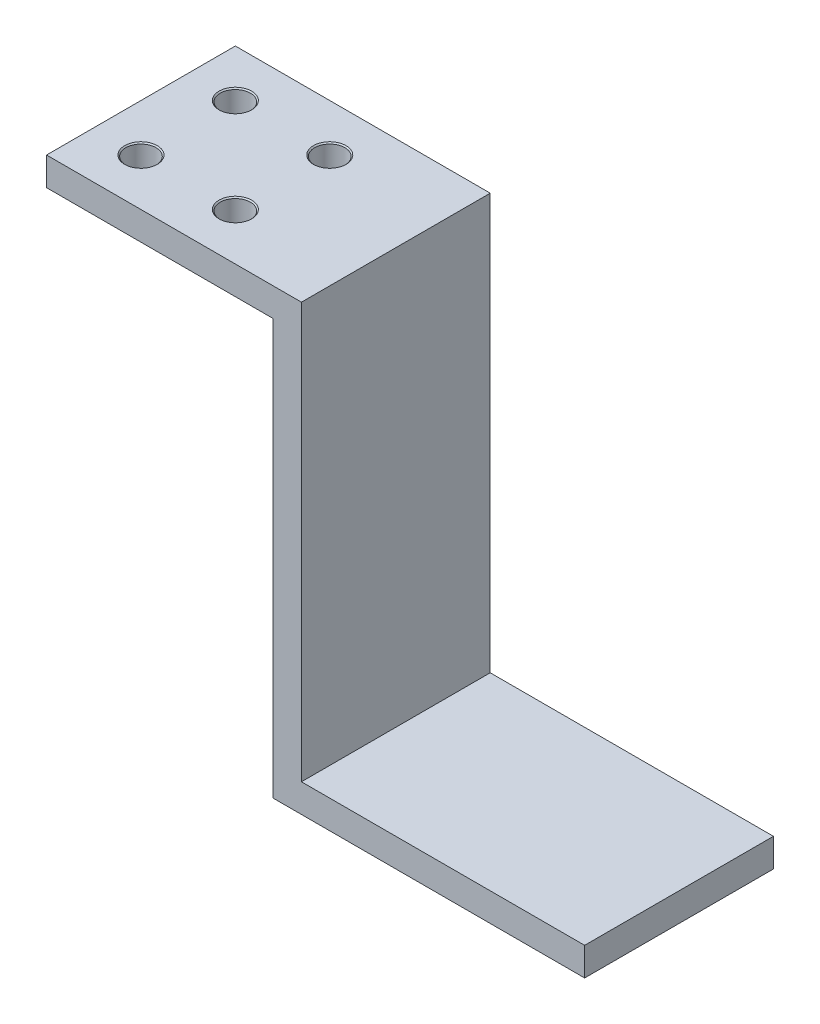
ISO-10303-21;
HEADER;
FILE_DESCRIPTION(('STEP AP214'),'2;1');
FILE_NAME('part.step','',(''),(''),'','','');
FILE_SCHEMA(('AUTOMOTIVE_DESIGN { 1 0 10303 214 1 1 1 1 }'));
ENDSEC;
DATA;
#1=APPLICATION_CONTEXT('core data for automotive mechanical design processes');
#2=APPLICATION_PROTOCOL_DEFINITION('international standard','automotive_design',2000,#1);
#3=PRODUCT_CONTEXT('',#1,'mechanical');
#4=PRODUCT('Part','Part','',(#3));
#5=PRODUCT_RELATED_PRODUCT_CATEGORY('part','',(#4));
#6=PRODUCT_DEFINITION_FORMATION('','',#4);
#7=PRODUCT_DEFINITION_CONTEXT('part definition',#1,'design');
#8=PRODUCT_DEFINITION('design','',#6,#7);
#9=PRODUCT_DEFINITION_SHAPE('','',#8);
#10=(LENGTH_UNIT() NAMED_UNIT(*) SI_UNIT(.MILLI.,.METRE.));
#11=(NAMED_UNIT(*) PLANE_ANGLE_UNIT() SI_UNIT($,.RADIAN.));
#12=(NAMED_UNIT(*) SI_UNIT($,.STERADIAN.) SOLID_ANGLE_UNIT());
#13=UNCERTAINTY_MEASURE_WITH_UNIT(LENGTH_MEASURE(1.E-05),#10,'distance_accuracy_value','');
#14=(GEOMETRIC_REPRESENTATION_CONTEXT(3) GLOBAL_UNCERTAINTY_ASSIGNED_CONTEXT((#13)) GLOBAL_UNIT_ASSIGNED_CONTEXT((#10,
#11,#12)) REPRESENTATION_CONTEXT('',''));
#15=CARTESIAN_POINT('',(0.,0.,0.));
#16=DIRECTION('',(0.,0.,1.));
#17=DIRECTION('',(1.,0.,0.));
#18=AXIS2_PLACEMENT_3D('',#15,#16,#17);
#19=CARTESIAN_POINT('',(0.,47.,20.));
#20=DIRECTION('',(1.,0.,0.));
#21=DIRECTION('',(0.,0.,-1.));
#22=AXIS2_PLACEMENT_3D('',#19,#20,#21);
#23=PLANE('',#22);
#24=DIRECTION('',(0.,-1.,0.));
#25=VECTOR('',#24,1.);
#26=CARTESIAN_POINT('',(0.,47.,0.));
#27=LINE('',#26,#25);
#28=CARTESIAN_POINT('',(0.,47.,0.));
#29=VERTEX_POINT('',#28);
#30=CARTESIAN_POINT('',(0.,44.,0.));
#31=VERTEX_POINT('',#30);
#32=EDGE_CURVE('E142',#29,#31,#27,.T.);
#33=ORIENTED_EDGE('',*,*,#32,.T.);
#34=DIRECTION('',(0.,0.,-1.));
#35=VECTOR('',#34,1.);
#36=CARTESIAN_POINT('',(0.,44.,20.));
#37=LINE('',#36,#35);
#38=CARTESIAN_POINT('',(0.,44.,20.));
#39=VERTEX_POINT('',#38);
#40=EDGE_CURVE('E11',#39,#31,#37,.T.);
#41=ORIENTED_EDGE('',*,*,#40,.F.);
#42=DIRECTION('',(0.,-1.,0.));
#43=VECTOR('',#42,1.);
#44=CARTESIAN_POINT('',(0.,47.,20.));
#45=LINE('',#44,#43);
#46=CARTESIAN_POINT('',(0.,47.,20.));
#47=VERTEX_POINT('',#46);
#48=EDGE_CURVE('E165',#47,#39,#45,.T.);
#49=ORIENTED_EDGE('',*,*,#48,.F.);
#50=DIRECTION('',(0.,0.,-1.));
#51=VECTOR('',#50,1.);
#52=CARTESIAN_POINT('',(0.,47.,20.));
#53=LINE('',#52,#51);
#54=EDGE_CURVE('E138',#47,#29,#53,.T.);
#55=ORIENTED_EDGE('',*,*,#54,.T.);
#56=EDGE_LOOP('',(#33,#41,#49,#55));
#57=FACE_BOUND('',#56,.T.);
#58=ADVANCED_FACE('F39',(#57),#23,.F.);
#59=CARTESIAN_POINT('',(0.,44.,20.));
#60=DIRECTION('',(0.,1.,0.));
#61=DIRECTION('',(0.,0.,1.));
#62=AXIS2_PLACEMENT_3D('',#59,#60,#61);
#63=PLANE('',#62);
#64=CARTESIAN_POINT('',(4.99999999999999,44.,5.));
#65=DIRECTION('',(0.,1.,0.));
#66=DIRECTION('',(0.,0.,1.));
#67=AXIS2_PLACEMENT_3D('',#64,#65,#66);
#68=CIRCLE('',#67,1.59999999999999);
#69=CARTESIAN_POINT('',(4.99999999999999,44.,6.59999999999999));
#70=VERTEX_POINT('',#69);
#71=EDGE_CURVE('E42',#70,#70,#68,.T.);
#72=ORIENTED_EDGE('',*,*,#71,.T.);
#73=EDGE_LOOP('',(#72));
#74=FACE_BOUND('',#73,.T.);
#75=CARTESIAN_POINT('',(4.99999999999999,44.,15.));
#76=DIRECTION('',(0.,1.,0.));
#77=DIRECTION('',(0.,0.,1.));
#78=AXIS2_PLACEMENT_3D('',#75,#76,#77);
#79=CIRCLE('',#78,1.59999999999999);
#80=CARTESIAN_POINT('',(4.99999999999999,44.,16.6));
#81=VERTEX_POINT('',#80);
#82=EDGE_CURVE('E192',#81,#81,#79,.T.);
#83=ORIENTED_EDGE('',*,*,#82,.T.);
#84=EDGE_LOOP('',(#83));
#85=FACE_BOUND('',#84,.T.);
#86=CARTESIAN_POINT('',(15.,44.,5.));
#87=DIRECTION('',(0.,1.,0.));
#88=DIRECTION('',(0.,0.,1.));
#89=AXIS2_PLACEMENT_3D('',#86,#87,#88);
#90=CIRCLE('',#89,1.59999999999999);
#91=CARTESIAN_POINT('',(15.,44.,6.59999999999999));
#92=VERTEX_POINT('',#91);
#93=EDGE_CURVE('E187',#92,#92,#90,.T.);
#94=ORIENTED_EDGE('',*,*,#93,.T.);
#95=EDGE_LOOP('',(#94));
#96=FACE_BOUND('',#95,.T.);
#97=CARTESIAN_POINT('',(15.,44.,15.));
#98=DIRECTION('',(0.,1.,0.));
#99=DIRECTION('',(0.,0.,1.));
#100=AXIS2_PLACEMENT_3D('',#97,#98,#99);
#101=CIRCLE('',#100,1.59999999999999);
#102=CARTESIAN_POINT('',(15.,44.,16.6));
#103=VERTEX_POINT('',#102);
#104=EDGE_CURVE('E147',#103,#103,#101,.T.);
#105=ORIENTED_EDGE('',*,*,#104,.T.);
#106=EDGE_LOOP('',(#105));
#107=FACE_BOUND('',#106,.T.);
#108=DIRECTION('',(1.,0.,0.));
#109=VECTOR('',#108,1.);
#110=CARTESIAN_POINT('',(0.,44.,0.));
#111=LINE('',#110,#109);
#112=CARTESIAN_POINT('',(24.,44.,0.));
#113=VERTEX_POINT('',#112);
#114=EDGE_CURVE('E146',#31,#113,#111,.T.);
#115=ORIENTED_EDGE('',*,*,#114,.T.);
#116=DIRECTION('',(0.,0.,-1.));
#117=VECTOR('',#116,1.);
#118=CARTESIAN_POINT('',(24.,44.,20.));
#119=LINE('',#118,#117);
#120=CARTESIAN_POINT('',(24.,44.,20.));
#121=VERTEX_POINT('',#120);
#122=EDGE_CURVE('E49',#121,#113,#119,.T.);
#123=ORIENTED_EDGE('',*,*,#122,.F.);
#124=DIRECTION('',(1.,0.,0.));
#125=VECTOR('',#124,1.);
#126=CARTESIAN_POINT('',(0.,44.,20.));
#127=LINE('',#126,#125);
#128=EDGE_CURVE('E101',#39,#121,#127,.T.);
#129=ORIENTED_EDGE('',*,*,#128,.F.);
#130=ORIENTED_EDGE('',*,*,#40,.T.);
#131=EDGE_LOOP('',(#115,#123,#129,#130));
#132=FACE_BOUND('',#131,.T.);
#133=ADVANCED_FACE('F263',(#74,#85,#96,#107,#132),#63,.F.);
#134=CARTESIAN_POINT('',(24.,44.,20.));
#135=DIRECTION('',(1.,0.,0.));
#136=DIRECTION('',(0.,1.,0.));
#137=AXIS2_PLACEMENT_3D('',#134,#135,#136);
#138=PLANE('',#137);
#139=DIRECTION('',(0.,-1.,0.));
#140=VECTOR('',#139,1.);
#141=CARTESIAN_POINT('',(24.,44.,0.));
#142=LINE('',#141,#140);
#143=CARTESIAN_POINT('',(24.,0.,0.));
#144=VERTEX_POINT('',#143);
#145=EDGE_CURVE('E150',#113,#144,#142,.T.);
#146=ORIENTED_EDGE('',*,*,#145,.T.);
#147=DIRECTION('',(0.,0.,-1.));
#148=VECTOR('',#147,1.);
#149=CARTESIAN_POINT('',(24.,0.,20.));
#150=LINE('',#149,#148);
#151=CARTESIAN_POINT('',(24.,0.,20.));
#152=VERTEX_POINT('',#151);
#153=EDGE_CURVE('E176',#152,#144,#150,.T.);
#154=ORIENTED_EDGE('',*,*,#153,.F.);
#155=DIRECTION('',(0.,-1.,0.));
#156=VECTOR('',#155,1.);
#157=CARTESIAN_POINT('',(24.,44.,20.));
#158=LINE('',#157,#156);
#159=EDGE_CURVE('E226',#121,#152,#158,.T.);
#160=ORIENTED_EDGE('',*,*,#159,.F.);
#161=ORIENTED_EDGE('',*,*,#122,.T.);
#162=EDGE_LOOP('',(#146,#154,#160,#161));
#163=FACE_BOUND('',#162,.T.);
#164=ADVANCED_FACE('F267',(#163),#138,.F.);
#165=CARTESIAN_POINT('',(24.,0.,20.));
#166=DIRECTION('',(0.,1.,0.));
#167=DIRECTION('',(0.,0.,1.));
#168=AXIS2_PLACEMENT_3D('',#165,#166,#167);
#169=PLANE('',#168);
#170=DIRECTION('',(1.,0.,0.));
#171=VECTOR('',#170,1.);
#172=CARTESIAN_POINT('',(24.,0.,0.));
#173=LINE('',#172,#171);
#174=CARTESIAN_POINT('',(57.,0.,0.));
#175=VERTEX_POINT('',#174);
#176=EDGE_CURVE('E153',#144,#175,#173,.T.);
#177=ORIENTED_EDGE('',*,*,#176,.T.);
#178=DIRECTION('',(0.,0.,-1.));
#179=VECTOR('',#178,1.);
#180=CARTESIAN_POINT('',(57.,0.,20.));
#181=LINE('',#180,#179);
#182=CARTESIAN_POINT('',(57.,0.,20.));
#183=VERTEX_POINT('',#182);
#184=EDGE_CURVE('E172',#183,#175,#181,.T.);
#185=ORIENTED_EDGE('',*,*,#184,.F.);
#186=DIRECTION('',(1.,0.,0.));
#187=VECTOR('',#186,1.);
#188=CARTESIAN_POINT('',(24.,0.,20.));
#189=LINE('',#188,#187);
#190=EDGE_CURVE('E229',#152,#183,#189,.T.);
#191=ORIENTED_EDGE('',*,*,#190,.F.);
#192=ORIENTED_EDGE('',*,*,#153,.T.);
#193=EDGE_LOOP('',(#177,#185,#191,#192));
#194=FACE_BOUND('',#193,.T.);
#195=ADVANCED_FACE('F237',(#194),#169,.F.);
#196=CARTESIAN_POINT('',(57.,0.,20.));
#197=DIRECTION('',(-1.,0.,0.));
#198=DIRECTION('',(0.,-1.,0.));
#199=AXIS2_PLACEMENT_3D('',#196,#197,#198);
#200=PLANE('',#199);
#201=DIRECTION('',(0.,1.,0.));
#202=VECTOR('',#201,1.);
#203=CARTESIAN_POINT('',(57.,0.,0.));
#204=LINE('',#203,#202);
#205=CARTESIAN_POINT('',(57.,3.,0.));
#206=VERTEX_POINT('',#205);
#207=EDGE_CURVE('E156',#175,#206,#204,.T.);
#208=ORIENTED_EDGE('',*,*,#207,.T.);
#209=DIRECTION('',(0.,0.,-1.));
#210=VECTOR('',#209,1.);
#211=CARTESIAN_POINT('',(57.,3.,20.));
#212=LINE('',#211,#210);
#213=CARTESIAN_POINT('',(57.,3.,20.));
#214=VERTEX_POINT('',#213);
#215=EDGE_CURVE('E131',#214,#206,#212,.T.);
#216=ORIENTED_EDGE('',*,*,#215,.F.);
#217=DIRECTION('',(0.,1.,0.));
#218=VECTOR('',#217,1.);
#219=CARTESIAN_POINT('',(57.,0.,20.));
#220=LINE('',#219,#218);
#221=EDGE_CURVE('E120',#183,#214,#220,.T.);
#222=ORIENTED_EDGE('',*,*,#221,.F.);
#223=ORIENTED_EDGE('',*,*,#184,.T.);
#224=EDGE_LOOP('',(#208,#216,#222,#223));
#225=FACE_BOUND('',#224,.T.);
#226=ADVANCED_FACE('F241',(#225),#200,.F.);
#227=CARTESIAN_POINT('',(57.,3.,20.));
#228=DIRECTION('',(0.,-1.,0.));
#229=DIRECTION('',(1.,0.,0.));
#230=AXIS2_PLACEMENT_3D('',#227,#228,#229);
#231=PLANE('',#230);
#232=DIRECTION('',(-1.,0.,0.));
#233=VECTOR('',#232,1.);
#234=CARTESIAN_POINT('',(57.,3.,0.));
#235=LINE('',#234,#233);
#236=CARTESIAN_POINT('',(27.,3.,0.));
#237=VERTEX_POINT('',#236);
#238=EDGE_CURVE('E129',#206,#237,#235,.T.);
#239=ORIENTED_EDGE('',*,*,#238,.T.);
#240=DIRECTION('',(0.,0.,-1.));
#241=VECTOR('',#240,1.);
#242=CARTESIAN_POINT('',(27.,3.,20.));
#243=LINE('',#242,#241);
#244=CARTESIAN_POINT('',(27.,3.,20.));
#245=VERTEX_POINT('',#244);
#246=EDGE_CURVE('E126',#245,#237,#243,.T.);
#247=ORIENTED_EDGE('',*,*,#246,.F.);
#248=DIRECTION('',(-1.,0.,0.));
#249=VECTOR('',#248,1.);
#250=CARTESIAN_POINT('',(57.,3.,20.));
#251=LINE('',#250,#249);
#252=EDGE_CURVE('E114',#214,#245,#251,.T.);
#253=ORIENTED_EDGE('',*,*,#252,.F.);
#254=ORIENTED_EDGE('',*,*,#215,.T.);
#255=EDGE_LOOP('',(#239,#247,#253,#254));
#256=FACE_BOUND('',#255,.T.);
#257=ADVANCED_FACE('F127',(#256),#231,.F.);
#258=CARTESIAN_POINT('',(27.,3.,20.));
#259=DIRECTION('',(-1.,0.,0.));
#260=DIRECTION('',(0.,-1.,0.));
#261=AXIS2_PLACEMENT_3D('',#258,#259,#260);
#262=PLANE('',#261);
#263=DIRECTION('',(0.,1.,0.));
#264=VECTOR('',#263,1.);
#265=CARTESIAN_POINT('',(27.,3.,0.));
#266=LINE('',#265,#264);
#267=CARTESIAN_POINT('',(27.,47.,0.));
#268=VERTEX_POINT('',#267);
#269=EDGE_CURVE('E87',#237,#268,#266,.T.);
#270=ORIENTED_EDGE('',*,*,#269,.T.);
#271=DIRECTION('',(0.,0.,-1.));
#272=VECTOR('',#271,1.);
#273=CARTESIAN_POINT('',(27.,47.,20.));
#274=LINE('',#273,#272);
#275=CARTESIAN_POINT('',(27.,47.,20.));
#276=VERTEX_POINT('',#275);
#277=EDGE_CURVE('E132',#276,#268,#274,.T.);
#278=ORIENTED_EDGE('',*,*,#277,.F.);
#279=DIRECTION('',(0.,1.,0.));
#280=VECTOR('',#279,1.);
#281=CARTESIAN_POINT('',(27.,3.,20.));
#282=LINE('',#281,#280);
#283=EDGE_CURVE('E118',#245,#276,#282,.T.);
#284=ORIENTED_EDGE('',*,*,#283,.F.);
#285=ORIENTED_EDGE('',*,*,#246,.T.);
#286=EDGE_LOOP('',(#270,#278,#284,#285));
#287=FACE_BOUND('',#286,.T.);
#288=ADVANCED_FACE('F134',(#287),#262,.F.);
#289=CARTESIAN_POINT('',(27.,47.,20.));
#290=DIRECTION('',(0.,-1.,0.));
#291=DIRECTION('',(1.,0.,0.));
#292=AXIS2_PLACEMENT_3D('',#289,#290,#291);
#293=PLANE('',#292);
#294=CARTESIAN_POINT('',(4.99999999999999,47.,5.));
#295=DIRECTION('',(0.,1.,0.));
#296=DIRECTION('',(0.,0.,1.));
#297=AXIS2_PLACEMENT_3D('',#294,#295,#296);
#298=CIRCLE('',#297,1.725);
#299=CARTESIAN_POINT('',(4.99999999999999,47.,6.725));
#300=VERTEX_POINT('',#299);
#301=EDGE_CURVE('E400',#300,#300,#298,.T.);
#302=ORIENTED_EDGE('',*,*,#301,.F.);
#303=EDGE_LOOP('',(#302));
#304=FACE_BOUND('',#303,.T.);
#305=CARTESIAN_POINT('',(4.99999999999999,47.,15.));
#306=DIRECTION('',(0.,1.,0.));
#307=DIRECTION('',(0.,0.,1.));
#308=AXIS2_PLACEMENT_3D('',#305,#306,#307);
#309=CIRCLE('',#308,1.725);
#310=CARTESIAN_POINT('',(4.99999999999999,47.,16.725));
#311=VERTEX_POINT('',#310);
#312=EDGE_CURVE('E204',#311,#311,#309,.T.);
#313=ORIENTED_EDGE('',*,*,#312,.F.);
#314=EDGE_LOOP('',(#313));
#315=FACE_BOUND('',#314,.T.);
#316=CARTESIAN_POINT('',(15.,47.,5.));
#317=DIRECTION('',(0.,1.,0.));
#318=DIRECTION('',(0.,0.,1.));
#319=AXIS2_PLACEMENT_3D('',#316,#317,#318);
#320=CIRCLE('',#319,1.725);
#321=CARTESIAN_POINT('',(15.,47.,6.725));
#322=VERTEX_POINT('',#321);
#323=EDGE_CURVE('E195',#322,#322,#320,.T.);
#324=ORIENTED_EDGE('',*,*,#323,.F.);
#325=EDGE_LOOP('',(#324));
#326=FACE_BOUND('',#325,.T.);
#327=CARTESIAN_POINT('',(15.,47.,15.));
#328=DIRECTION('',(0.,1.,0.));
#329=DIRECTION('',(0.,0.,1.));
#330=AXIS2_PLACEMENT_3D('',#327,#328,#329);
#331=CIRCLE('',#330,1.725);
#332=CARTESIAN_POINT('',(15.,47.,16.725));
#333=VERTEX_POINT('',#332);
#334=EDGE_CURVE('E190',#333,#333,#331,.T.);
#335=ORIENTED_EDGE('',*,*,#334,.F.);
#336=EDGE_LOOP('',(#335));
#337=FACE_BOUND('',#336,.T.);
#338=DIRECTION('',(-1.,0.,0.));
#339=VECTOR('',#338,1.);
#340=CARTESIAN_POINT('',(27.,47.,0.));
#341=LINE('',#340,#339);
#342=EDGE_CURVE('E93',#268,#29,#341,.T.);
#343=ORIENTED_EDGE('',*,*,#342,.T.);
#344=ORIENTED_EDGE('',*,*,#54,.F.);
#345=DIRECTION('',(-1.,0.,0.));
#346=VECTOR('',#345,1.);
#347=CARTESIAN_POINT('',(27.,47.,20.));
#348=LINE('',#347,#346);
#349=EDGE_CURVE('E58',#276,#47,#348,.T.);
#350=ORIENTED_EDGE('',*,*,#349,.F.);
#351=ORIENTED_EDGE('',*,*,#277,.T.);
#352=EDGE_LOOP('',(#343,#344,#350,#351));
#353=FACE_BOUND('',#352,.T.);
#354=ADVANCED_FACE('F249',(#304,#315,#326,#337,#353),#293,.F.);
#355=CARTESIAN_POINT('',(0.,0.,20.));
#356=DIRECTION('',(0.,0.,1.));
#357=DIRECTION('',(1.,0.,0.));
#358=AXIS2_PLACEMENT_3D('',#355,#356,#357);
#359=PLANE('',#358);
#360=ORIENTED_EDGE('',*,*,#48,.T.);
#361=ORIENTED_EDGE('',*,*,#128,.T.);
#362=ORIENTED_EDGE('',*,*,#159,.T.);
#363=ORIENTED_EDGE('',*,*,#190,.T.);
#364=ORIENTED_EDGE('',*,*,#221,.T.);
#365=ORIENTED_EDGE('',*,*,#252,.T.);
#366=ORIENTED_EDGE('',*,*,#283,.T.);
#367=ORIENTED_EDGE('',*,*,#349,.T.);
#368=EDGE_LOOP('',(#360,#361,#362,#363,#364,#365,#366,#367));
#369=FACE_BOUND('',#368,.T.);
#370=ADVANCED_FACE('F116',(#369),#359,.T.);
#371=CARTESIAN_POINT('',(0.,0.,0.));
#372=DIRECTION('',(0.,0.,1.));
#373=DIRECTION('',(1.,0.,0.));
#374=AXIS2_PLACEMENT_3D('',#371,#372,#373);
#375=PLANE('',#374);
#376=ORIENTED_EDGE('',*,*,#32,.F.);
#377=ORIENTED_EDGE('',*,*,#342,.F.);
#378=ORIENTED_EDGE('',*,*,#269,.F.);
#379=ORIENTED_EDGE('',*,*,#238,.F.);
#380=ORIENTED_EDGE('',*,*,#207,.F.);
#381=ORIENTED_EDGE('',*,*,#176,.F.);
#382=ORIENTED_EDGE('',*,*,#145,.F.);
#383=ORIENTED_EDGE('',*,*,#114,.F.);
#384=EDGE_LOOP('',(#376,#377,#378,#379,#380,#381,#382,#383));
#385=FACE_BOUND('',#384,.T.);
#386=ADVANCED_FACE('F244',(#385),#375,.F.);
#387=CARTESIAN_POINT('',(15.,47.,15.));
#388=DIRECTION('',(0.,1.,0.));
#389=DIRECTION('',(0.,0.,1.));
#390=AXIS2_PLACEMENT_3D('',#387,#388,#389);
#391=CYLINDRICAL_SURFACE('',#390,1.59999999999999);
#392=CARTESIAN_POINT('',(15.,46.875,15.));
#393=DIRECTION('',(0.,1.,0.));
#394=DIRECTION('',(0.,0.,1.));
#395=AXIS2_PLACEMENT_3D('',#392,#393,#394);
#396=CIRCLE('',#395,1.59999999999999);
#397=CARTESIAN_POINT('',(15.,46.875,16.6));
#398=VERTEX_POINT('',#397);
#399=EDGE_CURVE('E186',#398,#398,#396,.T.);
#400=ORIENTED_EDGE('',*,*,#399,.T.);
#401=EDGE_LOOP('',(#400));
#402=FACE_BOUND('',#401,.T.);
#403=ORIENTED_EDGE('',*,*,#104,.F.);
#404=EDGE_LOOP('',(#403));
#405=FACE_BOUND('',#404,.T.);
#406=ADVANCED_FACE('F304',(#402,#405),#391,.F.);
#407=CARTESIAN_POINT('',(15.,47.,15.));
#408=DIRECTION('',(0.,1.,0.));
#409=DIRECTION('',(0.,0.,1.));
#410=AXIS2_PLACEMENT_3D('',#407,#408,#409);
#411=CONICAL_SURFACE('',#410,1.725,0.785398163397448);
#412=ORIENTED_EDGE('',*,*,#399,.F.);
#413=EDGE_LOOP('',(#412));
#414=FACE_BOUND('',#413,.T.);
#415=ORIENTED_EDGE('',*,*,#334,.T.);
#416=EDGE_LOOP('',(#415));
#417=FACE_BOUND('',#416,.T.);
#418=ADVANCED_FACE('F322',(#414,#417),#411,.F.);
#419=CARTESIAN_POINT('',(15.,47.,5.));
#420=DIRECTION('',(0.,1.,0.));
#421=DIRECTION('',(0.,0.,1.));
#422=AXIS2_PLACEMENT_3D('',#419,#420,#421);
#423=CYLINDRICAL_SURFACE('',#422,1.59999999999999);
#424=CARTESIAN_POINT('',(15.,46.875,5.));
#425=DIRECTION('',(0.,1.,0.));
#426=DIRECTION('',(0.,0.,1.));
#427=AXIS2_PLACEMENT_3D('',#424,#425,#426);
#428=CIRCLE('',#427,1.59999999999999);
#429=CARTESIAN_POINT('',(15.,46.875,6.59999999999999));
#430=VERTEX_POINT('',#429);
#431=EDGE_CURVE('E191',#430,#430,#428,.T.);
#432=ORIENTED_EDGE('',*,*,#431,.T.);
#433=EDGE_LOOP('',(#432));
#434=FACE_BOUND('',#433,.T.);
#435=ORIENTED_EDGE('',*,*,#93,.F.);
#436=EDGE_LOOP('',(#435));
#437=FACE_BOUND('',#436,.T.);
#438=ADVANCED_FACE('F332',(#434,#437),#423,.F.);
#439=CARTESIAN_POINT('',(15.,47.,5.));
#440=DIRECTION('',(0.,1.,0.));
#441=DIRECTION('',(0.,0.,1.));
#442=AXIS2_PLACEMENT_3D('',#439,#440,#441);
#443=CONICAL_SURFACE('',#442,1.725,0.785398163397448);
#444=ORIENTED_EDGE('',*,*,#431,.F.);
#445=EDGE_LOOP('',(#444));
#446=FACE_BOUND('',#445,.T.);
#447=ORIENTED_EDGE('',*,*,#323,.T.);
#448=EDGE_LOOP('',(#447));
#449=FACE_BOUND('',#448,.T.);
#450=ADVANCED_FACE('F342',(#446,#449),#443,.F.);
#451=CARTESIAN_POINT('',(4.99999999999999,47.,15.));
#452=DIRECTION('',(0.,1.,0.));
#453=DIRECTION('',(0.,0.,1.));
#454=AXIS2_PLACEMENT_3D('',#451,#452,#453);
#455=CYLINDRICAL_SURFACE('',#454,1.59999999999999);
#456=CARTESIAN_POINT('',(4.99999999999999,46.875,15.));
#457=DIRECTION('',(0.,1.,0.));
#458=DIRECTION('',(0.,0.,1.));
#459=AXIS2_PLACEMENT_3D('',#456,#457,#458);
#460=CIRCLE('',#459,1.59999999999999);
#461=CARTESIAN_POINT('',(4.99999999999999,46.875,16.6));
#462=VERTEX_POINT('',#461);
#463=EDGE_CURVE('E196',#462,#462,#460,.T.);
#464=ORIENTED_EDGE('',*,*,#463,.T.);
#465=EDGE_LOOP('',(#464));
#466=FACE_BOUND('',#465,.T.);
#467=ORIENTED_EDGE('',*,*,#82,.F.);
#468=EDGE_LOOP('',(#467));
#469=FACE_BOUND('',#468,.T.);
#470=ADVANCED_FACE('F352',(#466,#469),#455,.F.);
#471=CARTESIAN_POINT('',(4.99999999999999,47.,15.));
#472=DIRECTION('',(0.,1.,0.));
#473=DIRECTION('',(0.,0.,1.));
#474=AXIS2_PLACEMENT_3D('',#471,#472,#473);
#475=CONICAL_SURFACE('',#474,1.725,0.785398163397448);
#476=ORIENTED_EDGE('',*,*,#463,.F.);
#477=EDGE_LOOP('',(#476));
#478=FACE_BOUND('',#477,.T.);
#479=ORIENTED_EDGE('',*,*,#312,.T.);
#480=EDGE_LOOP('',(#479));
#481=FACE_BOUND('',#480,.T.);
#482=ADVANCED_FACE('F362',(#478,#481),#475,.F.);
#483=CARTESIAN_POINT('',(4.99999999999999,47.,5.));
#484=DIRECTION('',(0.,1.,0.));
#485=DIRECTION('',(0.,0.,1.));
#486=AXIS2_PLACEMENT_3D('',#483,#484,#485);
#487=CYLINDRICAL_SURFACE('',#486,1.59999999999999);
#488=CARTESIAN_POINT('',(4.99999999999999,46.875,5.));
#489=DIRECTION('',(0.,1.,0.));
#490=DIRECTION('',(0.,0.,1.));
#491=AXIS2_PLACEMENT_3D('',#488,#489,#490);
#492=CIRCLE('',#491,1.59999999999999);
#493=CARTESIAN_POINT('',(4.99999999999999,46.875,6.59999999999999));
#494=VERTEX_POINT('',#493);
#495=EDGE_CURVE('E398',#494,#494,#492,.T.);
#496=ORIENTED_EDGE('',*,*,#495,.T.);
#497=EDGE_LOOP('',(#496));
#498=FACE_BOUND('',#497,.T.);
#499=ORIENTED_EDGE('',*,*,#71,.F.);
#500=EDGE_LOOP('',(#499));
#501=FACE_BOUND('',#500,.T.);
#502=ADVANCED_FACE('F371',(#498,#501),#487,.F.);
#503=CARTESIAN_POINT('',(4.99999999999999,47.,5.));
#504=DIRECTION('',(0.,1.,0.));
#505=DIRECTION('',(0.,0.,1.));
#506=AXIS2_PLACEMENT_3D('',#503,#504,#505);
#507=CONICAL_SURFACE('',#506,1.725,0.785398163397448);
#508=ORIENTED_EDGE('',*,*,#495,.F.);
#509=EDGE_LOOP('',(#508));
#510=FACE_BOUND('',#509,.T.);
#511=ORIENTED_EDGE('',*,*,#301,.T.);
#512=EDGE_LOOP('',(#511));
#513=FACE_BOUND('',#512,.T.);
#514=ADVANCED_FACE('F381',(#510,#513),#507,.F.);
#515=CLOSED_SHELL('',(#58,#133,#164,#195,#226,#257,#288,#354,#370,#386,#406,#418,#438,#450,#470,
#482,#502,#514));
#516=MANIFOLD_SOLID_BREP('B2',#515);
#517=ADVANCED_BREP_SHAPE_REPRESENTATION('',(#18,#516),#14);
#518=SHAPE_DEFINITION_REPRESENTATION(#9,#517);
ENDSEC;
END-ISO-10303-21;
